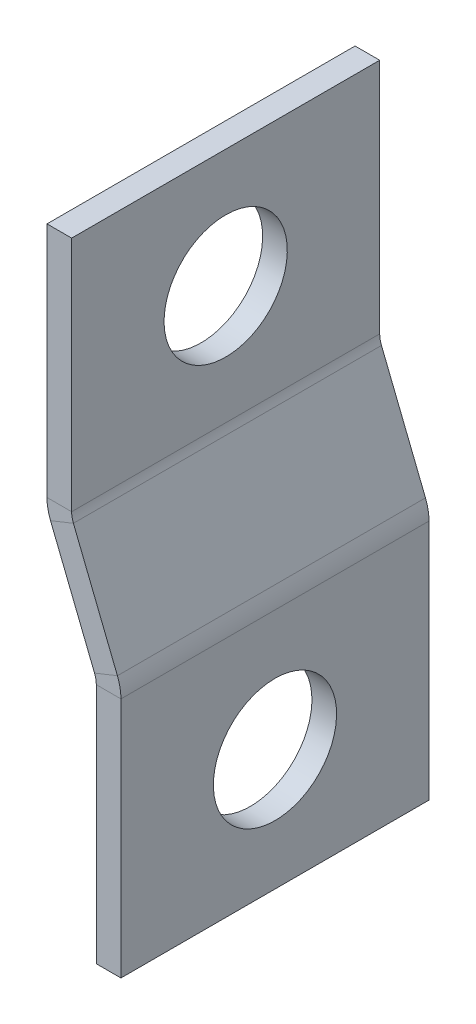
ISO-10303-21;
HEADER;
FILE_DESCRIPTION(('STEP AP214'),'2;1');
FILE_NAME('part.step','',(''),(''),'','','');
FILE_SCHEMA(('AUTOMOTIVE_DESIGN { 1 0 10303 214 1 1 1 1 }'));
ENDSEC;
DATA;
#1=APPLICATION_CONTEXT('core data for automotive mechanical design processes');
#2=APPLICATION_PROTOCOL_DEFINITION('international standard','automotive_design',2000,#1);
#3=PRODUCT_CONTEXT('',#1,'mechanical');
#4=PRODUCT('Part','Part','',(#3));
#5=PRODUCT_RELATED_PRODUCT_CATEGORY('part','',(#4));
#6=PRODUCT_DEFINITION_FORMATION('','',#4);
#7=PRODUCT_DEFINITION_CONTEXT('part definition',#1,'design');
#8=PRODUCT_DEFINITION('design','',#6,#7);
#9=PRODUCT_DEFINITION_SHAPE('','',#8);
#10=(LENGTH_UNIT() NAMED_UNIT(*) SI_UNIT(.MILLI.,.METRE.));
#11=(NAMED_UNIT(*) PLANE_ANGLE_UNIT() SI_UNIT($,.RADIAN.));
#12=(NAMED_UNIT(*) SI_UNIT($,.STERADIAN.) SOLID_ANGLE_UNIT());
#13=UNCERTAINTY_MEASURE_WITH_UNIT(LENGTH_MEASURE(1.E-05),#10,'distance_accuracy_value','');
#14=(GEOMETRIC_REPRESENTATION_CONTEXT(3) GLOBAL_UNCERTAINTY_ASSIGNED_CONTEXT((#13)) GLOBAL_UNIT_ASSIGNED_CONTEXT((#10,
#11,#12)) REPRESENTATION_CONTEXT('',''));
#15=CARTESIAN_POINT('',(0.,0.,0.));
#16=DIRECTION('',(0.,0.,1.));
#17=DIRECTION('',(1.,0.,0.));
#18=AXIS2_PLACEMENT_3D('',#15,#16,#17);
#19=CARTESIAN_POINT('',(0.,-19.229670385731,12.5));
#20=DIRECTION('',(0.,0.,1.));
#21=DIRECTION('',(1.,0.,0.));
#22=AXIS2_PLACEMENT_3D('',#19,#20,#21);
#23=PLANE('',#22);
#24=DIRECTION('',(1.,0.,0.));
#25=VECTOR('',#24,1.);
#26=CARTESIAN_POINT('',(0.,-19.229670385731,12.5));
#27=LINE('',#26,#25);
#28=CARTESIAN_POINT('',(0.,-19.229670385731,12.5));
#29=VERTEX_POINT('',#28);
#30=CARTESIAN_POINT('',(2.,-19.229670385731,12.5));
#31=VERTEX_POINT('',#30);
#32=EDGE_CURVE('E11',#29,#31,#27,.T.);
#33=ORIENTED_EDGE('',*,*,#32,.F.);
#34=CARTESIAN_POINT('',(4.,-19.229670385731,12.5));
#35=DIRECTION('',(0.,0.,-1.));
#36=DIRECTION('',(-1.,0.,0.));
#37=AXIS2_PLACEMENT_3D('',#34,#35,#36);
#38=CIRCLE('',#37,4.);
#39=CARTESIAN_POINT('',(0.286093236458962,-20.7152330911474,12.5));
#40=VERTEX_POINT('',#39);
#41=EDGE_CURVE('E146',#29,#40,#38,.F.);
#42=ORIENTED_EDGE('',*,*,#41,.T.);
#43=DIRECTION('',(-0.928476690885259,-0.371390676354104,0.));
#44=VECTOR('',#43,1.);
#45=CARTESIAN_POINT('',(2.14304661822948,-19.9724517384392,12.5));
#46=LINE('',#45,#44);
#47=CARTESIAN_POINT('',(2.14304661822948,-19.9724517384392,12.5));
#48=VERTEX_POINT('',#47);
#49=EDGE_CURVE('E43',#48,#40,#46,.T.);
#50=ORIENTED_EDGE('',*,*,#49,.F.);
#51=CARTESIAN_POINT('',(4.,-19.229670385731,12.5));
#52=DIRECTION('',(0.,0.,1.));
#53=DIRECTION('',(1.,0.,0.));
#54=AXIS2_PLACEMENT_3D('',#51,#52,#53);
#55=CIRCLE('',#54,2.);
#56=EDGE_CURVE('E241',#31,#48,#55,.T.);
#57=ORIENTED_EDGE('',*,*,#56,.F.);
#58=EDGE_LOOP('',(#33,#42,#50,#57));
#59=FACE_BOUND('',#58,.T.);
#60=ADVANCED_FACE('F34',(#59),#23,.T.);
#61=CARTESIAN_POINT('',(2.14304661822948,-19.9724517384392,12.5));
#62=DIRECTION('',(0.,0.,1.));
#63=DIRECTION('',(1.,0.,0.));
#64=AXIS2_PLACEMENT_3D('',#61,#62,#63);
#65=PLANE('',#64);
#66=DIRECTION('',(0.,-1.,0.));
#67=VECTOR('',#66,1.);
#68=CARTESIAN_POINT('',(0.,0.,12.5));
#69=LINE('',#68,#67);
#70=CARTESIAN_POINT('',(0.,0.,12.5));
#71=VERTEX_POINT('',#70);
#72=EDGE_CURVE('E151',#71,#29,#69,.T.);
#73=ORIENTED_EDGE('',*,*,#72,.T.);
#74=ORIENTED_EDGE('',*,*,#32,.T.);
#75=DIRECTION('',(0.,-1.,0.));
#76=VECTOR('',#75,1.);
#77=CARTESIAN_POINT('',(2.,0.,12.5));
#78=LINE('',#77,#76);
#79=CARTESIAN_POINT('',(2.,0.,12.5));
#80=VERTEX_POINT('',#79);
#81=EDGE_CURVE('E254',#80,#31,#78,.T.);
#82=ORIENTED_EDGE('',*,*,#81,.F.);
#83=DIRECTION('',(1.,0.,0.));
#84=VECTOR('',#83,1.);
#85=CARTESIAN_POINT('',(0.,0.,12.5));
#86=LINE('',#85,#84);
#87=EDGE_CURVE('E256',#71,#80,#86,.T.);
#88=ORIENTED_EDGE('',*,*,#87,.F.);
#89=EDGE_LOOP('',(#73,#74,#82,#88));
#90=FACE_BOUND('',#89,.T.);
#91=ADVANCED_FACE('F267',(#90),#65,.T.);
#92=CARTESIAN_POINT('',(0.286093236458962,-20.7152330911474,-12.5));
#93=DIRECTION('',(0.,0.,-1.));
#94=DIRECTION('',(-1.,0.,0.));
#95=AXIS2_PLACEMENT_3D('',#92,#93,#94);
#96=PLANE('',#95);
#97=DIRECTION('',(0.928476690885259,0.371390676354104,0.));
#98=VECTOR('',#97,1.);
#99=CARTESIAN_POINT('',(0.286093236458962,-20.7152330911474,-12.5));
#100=LINE('',#99,#98);
#101=CARTESIAN_POINT('',(0.286093236458962,-20.7152330911474,-12.5));
#102=VERTEX_POINT('',#101);
#103=CARTESIAN_POINT('',(2.14304661822948,-19.9724517384392,-12.5));
#104=VERTEX_POINT('',#103);
#105=EDGE_CURVE('E143',#102,#104,#100,.T.);
#106=ORIENTED_EDGE('',*,*,#105,.F.);
#107=CARTESIAN_POINT('',(4.,-19.229670385731,-12.5));
#108=DIRECTION('',(0.,0.,-1.));
#109=DIRECTION('',(-1.,0.,0.));
#110=AXIS2_PLACEMENT_3D('',#107,#108,#109);
#111=CIRCLE('',#110,4.);
#112=CARTESIAN_POINT('',(0.,-19.229670385731,-12.5));
#113=VERTEX_POINT('',#112);
#114=EDGE_CURVE('E158',#113,#102,#111,.F.);
#115=ORIENTED_EDGE('',*,*,#114,.F.);
#116=DIRECTION('',(-1.,0.,0.));
#117=VECTOR('',#116,1.);
#118=CARTESIAN_POINT('',(2.,-19.229670385731,-12.5));
#119=LINE('',#118,#117);
#120=CARTESIAN_POINT('',(2.,-19.229670385731,-12.5));
#121=VERTEX_POINT('',#120);
#122=EDGE_CURVE('E232',#121,#113,#119,.T.);
#123=ORIENTED_EDGE('',*,*,#122,.F.);
#124=CARTESIAN_POINT('',(4.,-19.229670385731,-12.5));
#125=DIRECTION('',(0.,0.,1.));
#126=DIRECTION('',(1.,0.,0.));
#127=AXIS2_PLACEMENT_3D('',#124,#125,#126);
#128=CIRCLE('',#127,2.);
#129=EDGE_CURVE('E186',#121,#104,#128,.T.);
#130=ORIENTED_EDGE('',*,*,#129,.T.);
#131=EDGE_LOOP('',(#106,#115,#123,#130));
#132=FACE_BOUND('',#131,.T.);
#133=ADVANCED_FACE('F246',(#132),#96,.T.);
#134=CARTESIAN_POINT('',(2.,-19.229670385731,-12.5));
#135=DIRECTION('',(0.,0.,-1.));
#136=DIRECTION('',(-1.,0.,0.));
#137=AXIS2_PLACEMENT_3D('',#134,#135,#136);
#138=PLANE('',#137);
#139=DIRECTION('',(0.371390676354104,-0.928476690885259,0.));
#140=VECTOR('',#139,1.);
#141=CARTESIAN_POINT('',(0.,-20.,-12.5));
#142=LINE('',#141,#140);
#143=CARTESIAN_POINT('',(3.85695338177052,-29.6423834544263,-12.5));
#144=VERTEX_POINT('',#143);
#145=EDGE_CURVE('E199',#102,#144,#142,.T.);
#146=ORIENTED_EDGE('',*,*,#145,.F.);
#147=ORIENTED_EDGE('',*,*,#105,.T.);
#148=DIRECTION('',(0.371390676354104,-0.928476690885259,0.));
#149=VECTOR('',#148,1.);
#150=CARTESIAN_POINT('',(1.85695338177052,-19.2572186472918,-12.5));
#151=LINE('',#150,#149);
#152=CARTESIAN_POINT('',(5.71390676354104,-28.8996021017181,-12.5));
#153=VERTEX_POINT('',#152);
#154=EDGE_CURVE('E184',#104,#153,#151,.T.);
#155=ORIENTED_EDGE('',*,*,#154,.T.);
#156=DIRECTION('',(-0.928476690885259,-0.371390676354105,0.));
#157=VECTOR('',#156,1.);
#158=CARTESIAN_POINT('',(5.71390676354104,-28.8996021017181,-12.5));
#159=LINE('',#158,#157);
#160=EDGE_CURVE('E92',#153,#144,#159,.T.);
#161=ORIENTED_EDGE('',*,*,#160,.T.);
#162=EDGE_LOOP('',(#146,#147,#155,#161));
#163=FACE_BOUND('',#162,.T.);
#164=ADVANCED_FACE('F234',(#163),#138,.T.);
#165=CARTESIAN_POINT('',(3.85695338177052,-29.6423834544263,12.5));
#166=DIRECTION('',(0.,0.,1.));
#167=DIRECTION('',(1.,0.,0.));
#168=AXIS2_PLACEMENT_3D('',#165,#166,#167);
#169=PLANE('',#168);
#170=DIRECTION('',(0.928476690885259,0.371390676354105,0.));
#171=VECTOR('',#170,1.);
#172=CARTESIAN_POINT('',(3.85695338177052,-29.6423834544263,12.5));
#173=LINE('',#172,#171);
#174=CARTESIAN_POINT('',(3.85695338177052,-29.6423834544263,12.5));
#175=VERTEX_POINT('',#174);
#176=CARTESIAN_POINT('',(5.71390676354104,-28.8996021017181,12.5));
#177=VERTEX_POINT('',#176);
#178=EDGE_CURVE('E230',#175,#177,#173,.T.);
#179=ORIENTED_EDGE('',*,*,#178,.F.);
#180=CARTESIAN_POINT('',(2.,-30.3851648071345,12.5));
#181=DIRECTION('',(0.,0.,1.));
#182=DIRECTION('',(1.,0.,0.));
#183=AXIS2_PLACEMENT_3D('',#180,#181,#182);
#184=CIRCLE('',#183,2.);
#185=CARTESIAN_POINT('',(4.,-30.3851648071345,12.5));
#186=VERTEX_POINT('',#185);
#187=EDGE_CURVE('E166',#175,#186,#184,.F.);
#188=ORIENTED_EDGE('',*,*,#187,.T.);
#189=DIRECTION('',(-1.,0.,0.));
#190=VECTOR('',#189,1.);
#191=CARTESIAN_POINT('',(6.,-30.3851648071345,12.5));
#192=LINE('',#191,#190);
#193=CARTESIAN_POINT('',(6.,-30.3851648071345,12.5));
#194=VERTEX_POINT('',#193);
#195=EDGE_CURVE('E51',#194,#186,#192,.T.);
#196=ORIENTED_EDGE('',*,*,#195,.F.);
#197=CARTESIAN_POINT('',(2.,-30.3851648071345,12.5));
#198=DIRECTION('',(0.,0.,1.));
#199=DIRECTION('',(1.,0.,0.));
#200=AXIS2_PLACEMENT_3D('',#197,#198,#199);
#201=CIRCLE('',#200,4.);
#202=EDGE_CURVE('E258',#177,#194,#201,.F.);
#203=ORIENTED_EDGE('',*,*,#202,.F.);
#204=EDGE_LOOP('',(#179,#188,#196,#203));
#205=FACE_BOUND('',#204,.T.);
#206=ADVANCED_FACE('F295',(#205),#169,.T.);
#207=CARTESIAN_POINT('',(6.,-30.3851648071345,12.5));
#208=DIRECTION('',(0.,0.,1.));
#209=DIRECTION('',(1.,0.,0.));
#210=AXIS2_PLACEMENT_3D('',#207,#208,#209);
#211=PLANE('',#210);
#212=DIRECTION('',(0.371390676354104,-0.928476690885259,0.));
#213=VECTOR('',#212,1.);
#214=CARTESIAN_POINT('',(0.,-20.,12.5));
#215=LINE('',#214,#213);
#216=EDGE_CURVE('E135',#40,#175,#215,.T.);
#217=ORIENTED_EDGE('',*,*,#216,.T.);
#218=ORIENTED_EDGE('',*,*,#178,.T.);
#219=DIRECTION('',(0.371390676354104,-0.928476690885259,0.));
#220=VECTOR('',#219,1.);
#221=CARTESIAN_POINT('',(1.85695338177052,-19.2572186472918,12.5));
#222=LINE('',#221,#220);
#223=EDGE_CURVE('E138',#48,#177,#222,.T.);
#224=ORIENTED_EDGE('',*,*,#223,.F.);
#225=ORIENTED_EDGE('',*,*,#49,.T.);
#226=EDGE_LOOP('',(#217,#218,#224,#225));
#227=FACE_BOUND('',#226,.T.);
#228=ADVANCED_FACE('F133',(#227),#211,.T.);
#229=CARTESIAN_POINT('',(4.,-30.3851648071345,-12.5));
#230=DIRECTION('',(0.,0.,-1.));
#231=DIRECTION('',(-1.,0.,0.));
#232=AXIS2_PLACEMENT_3D('',#229,#230,#231);
#233=PLANE('',#232);
#234=DIRECTION('',(1.,0.,0.));
#235=VECTOR('',#234,1.);
#236=CARTESIAN_POINT('',(4.,-30.3851648071345,-12.5));
#237=LINE('',#236,#235);
#238=CARTESIAN_POINT('',(4.,-30.3851648071345,-12.5));
#239=VERTEX_POINT('',#238);
#240=CARTESIAN_POINT('',(6.,-30.3851648071345,-12.5));
#241=VERTEX_POINT('',#240);
#242=EDGE_CURVE('E99',#239,#241,#237,.T.);
#243=ORIENTED_EDGE('',*,*,#242,.F.);
#244=CARTESIAN_POINT('',(2.,-30.3851648071345,-12.5));
#245=DIRECTION('',(0.,0.,1.));
#246=DIRECTION('',(1.,0.,0.));
#247=AXIS2_PLACEMENT_3D('',#244,#245,#246);
#248=CIRCLE('',#247,2.);
#249=EDGE_CURVE('E201',#144,#239,#248,.F.);
#250=ORIENTED_EDGE('',*,*,#249,.F.);
#251=ORIENTED_EDGE('',*,*,#160,.F.);
#252=CARTESIAN_POINT('',(2.,-30.3851648071345,-12.5));
#253=DIRECTION('',(0.,0.,1.));
#254=DIRECTION('',(1.,0.,0.));
#255=AXIS2_PLACEMENT_3D('',#252,#253,#254);
#256=CIRCLE('',#255,4.);
#257=EDGE_CURVE('E182',#153,#241,#256,.F.);
#258=ORIENTED_EDGE('',*,*,#257,.T.);
#259=EDGE_LOOP('',(#243,#250,#251,#258));
#260=FACE_BOUND('',#259,.T.);
#261=ADVANCED_FACE('F301',(#260),#233,.T.);
#262=CARTESIAN_POINT('',(5.71390676354104,-28.8996021017181,-12.5));
#263=DIRECTION('',(0.,0.,-1.));
#264=DIRECTION('',(-1.,0.,0.));
#265=AXIS2_PLACEMENT_3D('',#262,#263,#264);
#266=PLANE('',#265);
#267=DIRECTION('',(0.,-1.,0.));
#268=VECTOR('',#267,1.);
#269=CARTESIAN_POINT('',(4.,-30.,-12.5));
#270=LINE('',#269,#268);
#271=CARTESIAN_POINT('',(4.00000000000001,-50.,-12.5));
#272=VERTEX_POINT('',#271);
#273=EDGE_CURVE('E172',#239,#272,#270,.T.);
#274=ORIENTED_EDGE('',*,*,#273,.F.);
#275=ORIENTED_EDGE('',*,*,#242,.T.);
#276=DIRECTION('',(0.,-1.,0.));
#277=VECTOR('',#276,1.);
#278=CARTESIAN_POINT('',(6.,-30.,-12.5));
#279=LINE('',#278,#277);
#280=CARTESIAN_POINT('',(6.00000000000001,-50.,-12.5));
#281=VERTEX_POINT('',#280);
#282=EDGE_CURVE('E179',#241,#281,#279,.T.);
#283=ORIENTED_EDGE('',*,*,#282,.T.);
#284=DIRECTION('',(-1.,0.,0.));
#285=VECTOR('',#284,1.);
#286=CARTESIAN_POINT('',(6.00000000000001,-50.,-12.5));
#287=LINE('',#286,#285);
#288=EDGE_CURVE('E175',#281,#272,#287,.T.);
#289=ORIENTED_EDGE('',*,*,#288,.T.);
#290=EDGE_LOOP('',(#274,#275,#283,#289));
#291=FACE_BOUND('',#290,.T.);
#292=ADVANCED_FACE('F304',(#291),#266,.T.);
#293=CARTESIAN_POINT('',(4.,-30.,12.5));
#294=DIRECTION('',(1.,0.,0.));
#295=DIRECTION('',(0.,1.,0.));
#296=AXIS2_PLACEMENT_3D('',#293,#294,#295);
#297=PLANE('',#296);
#298=CARTESIAN_POINT('',(4.00000000000001,-40.1925824035672,0.));
#299=DIRECTION('',(1.,0.,0.));
#300=DIRECTION('',(0.,1.,0.));
#301=AXIS2_PLACEMENT_3D('',#298,#299,#300);
#302=CIRCLE('',#301,5.);
#303=CARTESIAN_POINT('',(4.00000000000001,-35.1925824035673,0.));
#304=VERTEX_POINT('',#303);
#305=EDGE_CURVE('E176',#304,#304,#302,.T.);
#306=ORIENTED_EDGE('',*,*,#305,.T.);
#307=EDGE_LOOP('',(#306));
#308=FACE_BOUND('',#307,.T.);
#309=ORIENTED_EDGE('',*,*,#273,.T.);
#310=DIRECTION('',(0.,0.,-1.));
#311=VECTOR('',#310,1.);
#312=CARTESIAN_POINT('',(4.00000000000001,-50.,12.5));
#313=LINE('',#312,#311);
#314=CARTESIAN_POINT('',(4.00000000000001,-50.,12.5));
#315=VERTEX_POINT('',#314);
#316=EDGE_CURVE('E225',#315,#272,#313,.T.);
#317=ORIENTED_EDGE('',*,*,#316,.F.);
#318=DIRECTION('',(0.,-1.,0.));
#319=VECTOR('',#318,1.);
#320=CARTESIAN_POINT('',(4.,-30.,12.5));
#321=LINE('',#320,#319);
#322=EDGE_CURVE('E105',#186,#315,#321,.T.);
#323=ORIENTED_EDGE('',*,*,#322,.F.);
#324=DIRECTION('',(0.,0.,-1.));
#325=VECTOR('',#324,1.);
#326=CARTESIAN_POINT('',(4.,-30.3851648071345,12.5));
#327=LINE('',#326,#325);
#328=EDGE_CURVE('E168',#186,#239,#327,.T.);
#329=ORIENTED_EDGE('',*,*,#328,.T.);
#330=EDGE_LOOP('',(#309,#317,#323,#329));
#331=FACE_BOUND('',#330,.T.);
#332=ADVANCED_FACE('F307',(#308,#331),#297,.F.);
#333=CARTESIAN_POINT('',(6.00000000000001,-50.,12.5));
#334=DIRECTION('',(0.,-1.,0.));
#335=DIRECTION('',(0.,0.,-1.));
#336=AXIS2_PLACEMENT_3D('',#333,#334,#335);
#337=PLANE('',#336);
#338=ORIENTED_EDGE('',*,*,#288,.F.);
#339=DIRECTION('',(0.,0.,-1.));
#340=VECTOR('',#339,1.);
#341=CARTESIAN_POINT('',(6.00000000000001,-50.,12.5));
#342=LINE('',#341,#340);
#343=CARTESIAN_POINT('',(6.00000000000001,-50.,12.5));
#344=VERTEX_POINT('',#343);
#345=EDGE_CURVE('E223',#344,#281,#342,.T.);
#346=ORIENTED_EDGE('',*,*,#345,.F.);
#347=DIRECTION('',(-1.,0.,0.));
#348=VECTOR('',#347,1.);
#349=CARTESIAN_POINT('',(6.00000000000001,-50.,12.5));
#350=LINE('',#349,#348);
#351=EDGE_CURVE('E540',#344,#315,#350,.T.);
#352=ORIENTED_EDGE('',*,*,#351,.T.);
#353=ORIENTED_EDGE('',*,*,#316,.T.);
#354=EDGE_LOOP('',(#338,#346,#352,#353));
#355=FACE_BOUND('',#354,.T.);
#356=ADVANCED_FACE('F311',(#355),#337,.T.);
#357=CARTESIAN_POINT('',(6.,-30.,12.5));
#358=DIRECTION('',(1.,0.,0.));
#359=DIRECTION('',(0.,1.,0.));
#360=AXIS2_PLACEMENT_3D('',#357,#358,#359);
#361=PLANE('',#360);
#362=CARTESIAN_POINT('',(6.,-40.1925824035672,0.));
#363=DIRECTION('',(1.,0.,0.));
#364=DIRECTION('',(0.,1.,0.));
#365=AXIS2_PLACEMENT_3D('',#362,#363,#364);
#366=CIRCLE('',#365,5.);
#367=CARTESIAN_POINT('',(6.,-35.1925824035673,0.));
#368=VERTEX_POINT('',#367);
#369=EDGE_CURVE('E553',#368,#368,#366,.T.);
#370=ORIENTED_EDGE('',*,*,#369,.F.);
#371=EDGE_LOOP('',(#370));
#372=FACE_BOUND('',#371,.T.);
#373=ORIENTED_EDGE('',*,*,#282,.F.);
#374=DIRECTION('',(0.,0.,-1.));
#375=VECTOR('',#374,1.);
#376=CARTESIAN_POINT('',(6.,-30.3851648071345,12.5));
#377=LINE('',#376,#375);
#378=EDGE_CURVE('E220',#194,#241,#377,.T.);
#379=ORIENTED_EDGE('',*,*,#378,.F.);
#380=DIRECTION('',(0.,-1.,0.));
#381=VECTOR('',#380,1.);
#382=CARTESIAN_POINT('',(6.,-30.,12.5));
#383=LINE('',#382,#381);
#384=EDGE_CURVE('E542',#194,#344,#383,.T.);
#385=ORIENTED_EDGE('',*,*,#384,.T.);
#386=ORIENTED_EDGE('',*,*,#345,.T.);
#387=EDGE_LOOP('',(#373,#379,#385,#386));
#388=FACE_BOUND('',#387,.T.);
#389=ADVANCED_FACE('F315',(#372,#388),#361,.T.);
#390=CARTESIAN_POINT('',(2.,-30.3851648071345,12.5));
#391=DIRECTION('',(0.,0.,-1.));
#392=DIRECTION('',(-1.,0.,0.));
#393=AXIS2_PLACEMENT_3D('',#390,#391,#392);
#394=CYLINDRICAL_SURFACE('',#393,4.);
#395=ORIENTED_EDGE('',*,*,#257,.F.);
#396=DIRECTION('',(0.,0.,-1.));
#397=VECTOR('',#396,1.);
#398=CARTESIAN_POINT('',(5.71390676354104,-28.8996021017181,12.5));
#399=LINE('',#398,#397);
#400=EDGE_CURVE('E217',#177,#153,#399,.T.);
#401=ORIENTED_EDGE('',*,*,#400,.F.);
#402=ORIENTED_EDGE('',*,*,#202,.T.);
#403=ORIENTED_EDGE('',*,*,#378,.T.);
#404=EDGE_LOOP('',(#395,#401,#402,#403));
#405=FACE_BOUND('',#404,.T.);
#406=ADVANCED_FACE('F319',(#405),#394,.T.);
#407=CARTESIAN_POINT('',(1.85695338177052,-19.2572186472918,12.5));
#408=DIRECTION('',(0.928476690885259,0.371390676354104,0.));
#409=DIRECTION('',(-0.371390676354104,0.928476690885259,0.));
#410=AXIS2_PLACEMENT_3D('',#407,#408,#409);
#411=PLANE('',#410);
#412=ORIENTED_EDGE('',*,*,#154,.F.);
#413=DIRECTION('',(0.,0.,-1.));
#414=VECTOR('',#413,1.);
#415=CARTESIAN_POINT('',(2.14304661822948,-19.9724517384392,12.5));
#416=LINE('',#415,#414);
#417=EDGE_CURVE('E214',#48,#104,#416,.T.);
#418=ORIENTED_EDGE('',*,*,#417,.F.);
#419=ORIENTED_EDGE('',*,*,#223,.T.);
#420=ORIENTED_EDGE('',*,*,#400,.T.);
#421=EDGE_LOOP('',(#412,#418,#419,#420));
#422=FACE_BOUND('',#421,.T.);
#423=ADVANCED_FACE('F243',(#422),#411,.T.);
#424=CARTESIAN_POINT('',(4.,-19.229670385731,12.5));
#425=DIRECTION('',(0.,0.,-1.));
#426=DIRECTION('',(-1.,0.,0.));
#427=AXIS2_PLACEMENT_3D('',#424,#425,#426);
#428=CYLINDRICAL_SURFACE('',#427,2.);
#429=ORIENTED_EDGE('',*,*,#129,.F.);
#430=DIRECTION('',(0.,0.,-1.));
#431=VECTOR('',#430,1.);
#432=CARTESIAN_POINT('',(2.,-19.229670385731,12.5));
#433=LINE('',#432,#431);
#434=EDGE_CURVE('E211',#31,#121,#433,.T.);
#435=ORIENTED_EDGE('',*,*,#434,.F.);
#436=ORIENTED_EDGE('',*,*,#56,.T.);
#437=ORIENTED_EDGE('',*,*,#417,.T.);
#438=EDGE_LOOP('',(#429,#435,#436,#437));
#439=FACE_BOUND('',#438,.T.);
#440=ADVANCED_FACE('F239',(#439),#428,.F.);
#441=CARTESIAN_POINT('',(2.,0.,12.5));
#442=DIRECTION('',(1.,0.,0.));
#443=DIRECTION('',(0.,1.,0.));
#444=AXIS2_PLACEMENT_3D('',#441,#442,#443);
#445=PLANE('',#444);
#446=CARTESIAN_POINT('',(2.,-9.61483519286549,0.));
#447=DIRECTION('',(1.,0.,0.));
#448=DIRECTION('',(0.,1.,0.));
#449=AXIS2_PLACEMENT_3D('',#446,#447,#448);
#450=CIRCLE('',#449,5.);
#451=CARTESIAN_POINT('',(2.,-4.61483519286549,0.));
#452=VERTEX_POINT('',#451);
#453=EDGE_CURVE('E556',#452,#452,#450,.T.);
#454=ORIENTED_EDGE('',*,*,#453,.F.);
#455=EDGE_LOOP('',(#454));
#456=FACE_BOUND('',#455,.T.);
#457=DIRECTION('',(0.,-1.,0.));
#458=VECTOR('',#457,1.);
#459=CARTESIAN_POINT('',(2.,0.,-12.5));
#460=LINE('',#459,#458);
#461=CARTESIAN_POINT('',(2.,0.,-12.5));
#462=VERTEX_POINT('',#461);
#463=EDGE_CURVE('E189',#462,#121,#460,.T.);
#464=ORIENTED_EDGE('',*,*,#463,.F.);
#465=DIRECTION('',(0.,0.,-1.));
#466=VECTOR('',#465,1.);
#467=CARTESIAN_POINT('',(2.,0.,12.5));
#468=LINE('',#467,#466);
#469=EDGE_CURVE('E209',#80,#462,#468,.T.);
#470=ORIENTED_EDGE('',*,*,#469,.F.);
#471=ORIENTED_EDGE('',*,*,#81,.T.);
#472=ORIENTED_EDGE('',*,*,#434,.T.);
#473=EDGE_LOOP('',(#464,#470,#471,#472));
#474=FACE_BOUND('',#473,.T.);
#475=ADVANCED_FACE('F252',(#456,#474),#445,.T.);
#476=CARTESIAN_POINT('',(0.,0.,12.5));
#477=DIRECTION('',(0.,1.,0.));
#478=DIRECTION('',(-1.,0.,0.));
#479=AXIS2_PLACEMENT_3D('',#476,#477,#478);
#480=PLANE('',#479);
#481=DIRECTION('',(1.,0.,0.));
#482=VECTOR('',#481,1.);
#483=CARTESIAN_POINT('',(0.,0.,-12.5));
#484=LINE('',#483,#482);
#485=CARTESIAN_POINT('',(0.,0.,-12.5));
#486=VERTEX_POINT('',#485);
#487=EDGE_CURVE('E192',#486,#462,#484,.T.);
#488=ORIENTED_EDGE('',*,*,#487,.F.);
#489=DIRECTION('',(0.,0.,-1.));
#490=VECTOR('',#489,1.);
#491=CARTESIAN_POINT('',(0.,0.,12.5));
#492=LINE('',#491,#490);
#493=EDGE_CURVE('E207',#71,#486,#492,.T.);
#494=ORIENTED_EDGE('',*,*,#493,.F.);
#495=ORIENTED_EDGE('',*,*,#87,.T.);
#496=ORIENTED_EDGE('',*,*,#469,.T.);
#497=EDGE_LOOP('',(#488,#494,#495,#496));
#498=FACE_BOUND('',#497,.T.);
#499=ADVANCED_FACE('F273',(#498),#480,.T.);
#500=CARTESIAN_POINT('',(0.,0.,12.5));
#501=DIRECTION('',(1.,0.,0.));
#502=DIRECTION('',(0.,1.,0.));
#503=AXIS2_PLACEMENT_3D('',#500,#501,#502);
#504=PLANE('',#503);
#505=CARTESIAN_POINT('',(0.,-9.61483519286549,0.));
#506=DIRECTION('',(1.,0.,0.));
#507=DIRECTION('',(0.,1.,0.));
#508=AXIS2_PLACEMENT_3D('',#505,#506,#507);
#509=CIRCLE('',#508,5.);
#510=CARTESIAN_POINT('',(0.,-4.61483519286549,0.));
#511=VERTEX_POINT('',#510);
#512=EDGE_CURVE('E37',#511,#511,#509,.T.);
#513=ORIENTED_EDGE('',*,*,#512,.T.);
#514=EDGE_LOOP('',(#513));
#515=FACE_BOUND('',#514,.T.);
#516=DIRECTION('',(0.,-1.,0.));
#517=VECTOR('',#516,1.);
#518=CARTESIAN_POINT('',(0.,0.,-12.5));
#519=LINE('',#518,#517);
#520=EDGE_CURVE('E195',#486,#113,#519,.T.);
#521=ORIENTED_EDGE('',*,*,#520,.T.);
#522=DIRECTION('',(0.,0.,-1.));
#523=VECTOR('',#522,1.);
#524=CARTESIAN_POINT('',(0.,-19.229670385731,12.5));
#525=LINE('',#524,#523);
#526=EDGE_CURVE('E160',#29,#113,#525,.T.);
#527=ORIENTED_EDGE('',*,*,#526,.F.);
#528=ORIENTED_EDGE('',*,*,#72,.F.);
#529=ORIENTED_EDGE('',*,*,#493,.T.);
#530=EDGE_LOOP('',(#521,#527,#528,#529));
#531=FACE_BOUND('',#530,.T.);
#532=ADVANCED_FACE('F269',(#515,#531),#504,.F.);
#533=CARTESIAN_POINT('',(4.,-19.229670385731,12.5));
#534=DIRECTION('',(0.,0.,-1.));
#535=DIRECTION('',(-1.,0.,0.));
#536=AXIS2_PLACEMENT_3D('',#533,#534,#535);
#537=CYLINDRICAL_SURFACE('',#536,4.);
#538=ORIENTED_EDGE('',*,*,#114,.T.);
#539=DIRECTION('',(0.,0.,-1.));
#540=VECTOR('',#539,1.);
#541=CARTESIAN_POINT('',(0.286093236458962,-20.7152330911474,12.5));
#542=LINE('',#541,#540);
#543=EDGE_CURVE('E155',#40,#102,#542,.T.);
#544=ORIENTED_EDGE('',*,*,#543,.F.);
#545=ORIENTED_EDGE('',*,*,#41,.F.);
#546=ORIENTED_EDGE('',*,*,#526,.T.);
#547=EDGE_LOOP('',(#538,#544,#545,#546));
#548=FACE_BOUND('',#547,.T.);
#549=ADVANCED_FACE('F156',(#548),#537,.T.);
#550=CARTESIAN_POINT('',(0.,-20.,12.5));
#551=DIRECTION('',(0.928476690885259,0.371390676354104,0.));
#552=DIRECTION('',(-0.371390676354104,0.928476690885259,0.));
#553=AXIS2_PLACEMENT_3D('',#550,#551,#552);
#554=PLANE('',#553);
#555=ORIENTED_EDGE('',*,*,#145,.T.);
#556=DIRECTION('',(0.,0.,-1.));
#557=VECTOR('',#556,1.);
#558=CARTESIAN_POINT('',(3.85695338177052,-29.6423834544263,12.5));
#559=LINE('',#558,#557);
#560=EDGE_CURVE('E161',#175,#144,#559,.T.);
#561=ORIENTED_EDGE('',*,*,#560,.F.);
#562=ORIENTED_EDGE('',*,*,#216,.F.);
#563=ORIENTED_EDGE('',*,*,#543,.T.);
#564=EDGE_LOOP('',(#555,#561,#562,#563));
#565=FACE_BOUND('',#564,.T.);
#566=ADVANCED_FACE('F163',(#565),#554,.F.);
#567=CARTESIAN_POINT('',(2.,-30.3851648071345,12.5));
#568=DIRECTION('',(0.,0.,-1.));
#569=DIRECTION('',(-1.,0.,0.));
#570=AXIS2_PLACEMENT_3D('',#567,#568,#569);
#571=CYLINDRICAL_SURFACE('',#570,2.);
#572=ORIENTED_EDGE('',*,*,#249,.T.);
#573=ORIENTED_EDGE('',*,*,#328,.F.);
#574=ORIENTED_EDGE('',*,*,#187,.F.);
#575=ORIENTED_EDGE('',*,*,#560,.T.);
#576=EDGE_LOOP('',(#572,#573,#574,#575));
#577=FACE_BOUND('',#576,.T.);
#578=ADVANCED_FACE('F426',(#577),#571,.F.);
#579=CARTESIAN_POINT('',(2.,-30.3851648071345,12.5));
#580=DIRECTION('',(0.,0.,1.));
#581=DIRECTION('',(1.,0.,0.));
#582=AXIS2_PLACEMENT_3D('',#579,#580,#581);
#583=PLANE('',#582);
#584=ORIENTED_EDGE('',*,*,#322,.T.);
#585=ORIENTED_EDGE('',*,*,#351,.F.);
#586=ORIENTED_EDGE('',*,*,#384,.F.);
#587=ORIENTED_EDGE('',*,*,#195,.T.);
#588=EDGE_LOOP('',(#584,#585,#586,#587));
#589=FACE_BOUND('',#588,.T.);
#590=ADVANCED_FACE('F431',(#589),#583,.T.);
#591=CARTESIAN_POINT('',(2.,-30.3851648071345,-12.5));
#592=DIRECTION('',(0.,0.,1.));
#593=DIRECTION('',(1.,0.,0.));
#594=AXIS2_PLACEMENT_3D('',#591,#592,#593);
#595=PLANE('',#594);
#596=ORIENTED_EDGE('',*,*,#463,.T.);
#597=ORIENTED_EDGE('',*,*,#122,.T.);
#598=ORIENTED_EDGE('',*,*,#520,.F.);
#599=ORIENTED_EDGE('',*,*,#487,.T.);
#600=EDGE_LOOP('',(#596,#597,#598,#599));
#601=FACE_BOUND('',#600,.T.);
#602=ADVANCED_FACE('F271',(#601),#595,.F.);
#603=CARTESIAN_POINT('',(-4.,-40.1925824035672,0.));
#604=DIRECTION('',(1.,0.,0.));
#605=DIRECTION('',(0.,1.,0.));
#606=AXIS2_PLACEMENT_3D('',#603,#604,#605);
#607=CYLINDRICAL_SURFACE('',#606,5.);
#608=ORIENTED_EDGE('',*,*,#369,.T.);
#609=EDGE_LOOP('',(#608));
#610=FACE_BOUND('',#609,.T.);
#611=ORIENTED_EDGE('',*,*,#305,.F.);
#612=EDGE_LOOP('',(#611));
#613=FACE_BOUND('',#612,.T.);
#614=ADVANCED_FACE('F355',(#610,#613),#607,.F.);
#615=CARTESIAN_POINT('',(-4.,-9.61483519286549,0.));
#616=DIRECTION('',(1.,0.,0.));
#617=DIRECTION('',(0.,1.,0.));
#618=AXIS2_PLACEMENT_3D('',#615,#616,#617);
#619=CYLINDRICAL_SURFACE('',#618,5.);
#620=ORIENTED_EDGE('',*,*,#453,.T.);
#621=EDGE_LOOP('',(#620));
#622=FACE_BOUND('',#621,.T.);
#623=ORIENTED_EDGE('',*,*,#512,.F.);
#624=EDGE_LOOP('',(#623));
#625=FACE_BOUND('',#624,.T.);
#626=ADVANCED_FACE('F360',(#622,#625),#619,.F.);
#627=CLOSED_SHELL('',(#60,#91,#133,#164,#206,#228,#261,#292,#332,#356,#389,#406,#423,#440,#475,
#499,#532,#549,#566,#578,#590,#602,#614,#626));
#628=MANIFOLD_SOLID_BREP('B2',#627);
#629=ADVANCED_BREP_SHAPE_REPRESENTATION('',(#18,#628),#14);
#630=SHAPE_DEFINITION_REPRESENTATION(#9,#629);
ENDSEC;
END-ISO-10303-21;
